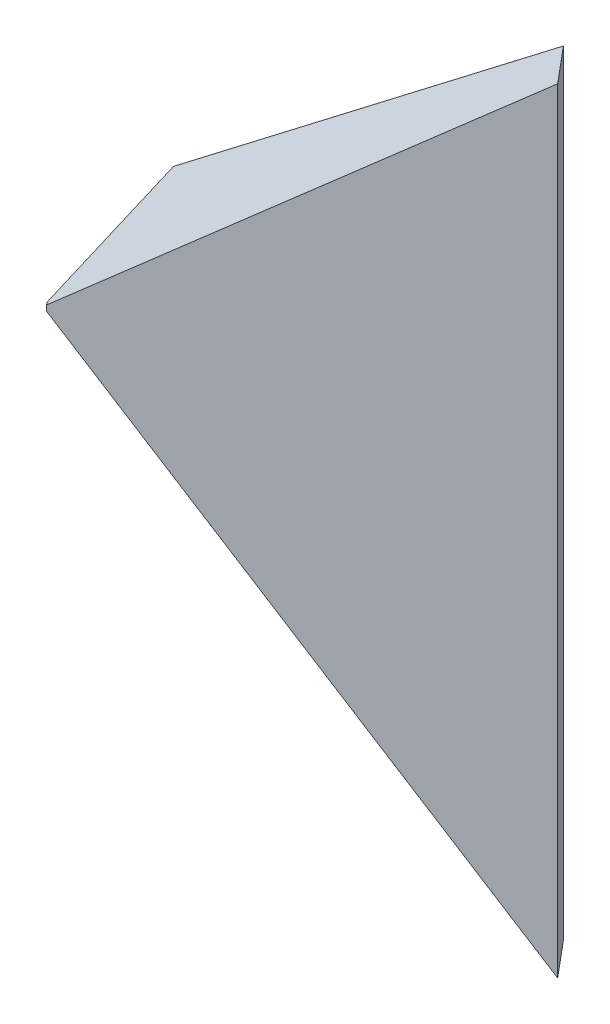
ISO-10303-21;
HEADER;
FILE_DESCRIPTION(('STEP AP214'),'2;1');
FILE_NAME('part.step','',(''),(''),'','','');
FILE_SCHEMA(('AUTOMOTIVE_DESIGN { 1 0 10303 214 1 1 1 1 }'));
ENDSEC;
DATA;
#1=APPLICATION_CONTEXT('core data for automotive mechanical design processes');
#2=APPLICATION_PROTOCOL_DEFINITION('international standard','automotive_design',2000,#1);
#3=PRODUCT_CONTEXT('',#1,'mechanical');
#4=PRODUCT('Part','Part','',(#3));
#5=PRODUCT_RELATED_PRODUCT_CATEGORY('part','',(#4));
#6=PRODUCT_DEFINITION_FORMATION('','',#4);
#7=PRODUCT_DEFINITION_CONTEXT('part definition',#1,'design');
#8=PRODUCT_DEFINITION('design','',#6,#7);
#9=PRODUCT_DEFINITION_SHAPE('','',#8);
#10=(LENGTH_UNIT() NAMED_UNIT(*) SI_UNIT(.MILLI.,.METRE.));
#11=(NAMED_UNIT(*) PLANE_ANGLE_UNIT() SI_UNIT($,.RADIAN.));
#12=(NAMED_UNIT(*) SI_UNIT($,.STERADIAN.) SOLID_ANGLE_UNIT());
#13=UNCERTAINTY_MEASURE_WITH_UNIT(LENGTH_MEASURE(1.E-05),#10,'distance_accuracy_value','');
#14=(GEOMETRIC_REPRESENTATION_CONTEXT(3) GLOBAL_UNCERTAINTY_ASSIGNED_CONTEXT((#13)) GLOBAL_UNIT_ASSIGNED_CONTEXT((#10,
#11,#12)) REPRESENTATION_CONTEXT('',''));
#15=CARTESIAN_POINT('',(0.,0.,0.));
#16=DIRECTION('',(0.,0.,1.));
#17=DIRECTION('',(1.,0.,0.));
#18=AXIS2_PLACEMENT_3D('',#15,#16,#17);
#19=CARTESIAN_POINT('',(775.8872661241,-32.34968528151,98.962617294373));
#20=DIRECTION('',(0.138308876163015,0.,0.990389143102106));
#21=DIRECTION('',(0.,-1.,0.));
#22=AXIS2_PLACEMENT_3D('',#19,#20,#21);
#23=PLANE('',#22);
#24=DIRECTION('',(0.,1.,0.));
#25=VECTOR('',#24,1.);
#26=CARTESIAN_POINT('',(211.19114167393,-37.35841955208,177.82301968278));
#27=LINE('',#26,#25);
#28=CARTESIAN_POINT('',(211.19114167393,-37.35841955208,177.82301968278));
#29=VERTEX_POINT('',#28);
#30=CARTESIAN_POINT('',(211.19114167393,-27.34095101094,177.82301968278));
#31=VERTEX_POINT('',#30);
#32=EDGE_CURVE('E10',#29,#31,#27,.T.);
#33=ORIENTED_EDGE('',*,*,#32,.F.);
#34=DIRECTION('',(0.754964302462711,-0.647234957258752,-0.10543155177296));
#35=VECTOR('',#34,1.);
#36=CARTESIAN_POINT('',(211.19114167393,-37.35841955208,177.82301968278));
#37=LINE('',#36,#35);
#38=CARTESIAN_POINT('',(1023.286902266,-733.5724831607,64.413000231037));
#39=VERTEX_POINT('',#38);
#40=EDGE_CURVE('E83',#29,#39,#37,.T.);
#41=ORIENTED_EDGE('',*,*,#40,.T.);
#42=DIRECTION('',(0.,-1.,0.));
#43=VECTOR('',#42,1.);
#44=CARTESIAN_POINT('',(1023.286902266,668.87311259773,64.413000231037));
#45=LINE('',#44,#43);
#46=CARTESIAN_POINT('',(1023.286902266,668.87311259773,64.413000231037));
#47=VERTEX_POINT('',#46);
#48=EDGE_CURVE('E19',#47,#39,#45,.T.);
#49=ORIENTED_EDGE('',*,*,#48,.F.);
#50=DIRECTION('',(-0.754964302462711,-0.647234957258752,0.10543155177296));
#51=VECTOR('',#50,1.);
#52=CARTESIAN_POINT('',(1023.286902266,668.87311259773,64.413000231037));
#53=LINE('',#52,#51);
#54=EDGE_CURVE('E128',#47,#31,#53,.T.);
#55=ORIENTED_EDGE('',*,*,#54,.T.);
#56=EDGE_LOOP('',(#33,#41,#49,#55));
#57=FACE_BOUND('',#56,.T.);
#58=ADVANCED_FACE('F15',(#57),#23,.T.);
#59=CARTESIAN_POINT('',(209.1789483457,-32.34968528151,175.42498105486));
#60=DIRECTION('',(-0.76604444311876,0.,0.642787609686799));
#61=DIRECTION('',(0.,1.,0.));
#62=AXIS2_PLACEMENT_3D('',#59,#60,#61);
#63=PLANE('',#62);
#64=DIRECTION('',(-0.642787609686799,0.,-0.76604444311876));
#65=VECTOR('',#64,1.);
#66=CARTESIAN_POINT('',(211.19114167393,-27.34095101094,177.82301968278));
#67=LINE('',#66,#65);
#68=CARTESIAN_POINT('',(207.16675501746,-27.34095101094,173.02694242694));
#69=VERTEX_POINT('',#68);
#70=EDGE_CURVE('E78',#31,#69,#67,.T.);
#71=ORIENTED_EDGE('',*,*,#70,.T.);
#72=DIRECTION('',(0.,-1.,0.));
#73=VECTOR('',#72,1.);
#74=CARTESIAN_POINT('',(207.16675501746,-27.34095101094,173.02694242694));
#75=LINE('',#74,#73);
#76=CARTESIAN_POINT('',(207.16675501746,-37.35841955208,173.02694242694));
#77=VERTEX_POINT('',#76);
#78=EDGE_CURVE('E72',#69,#77,#75,.T.);
#79=ORIENTED_EDGE('',*,*,#78,.T.);
#80=DIRECTION('',(0.642787609686799,0.,0.76604444311876));
#81=VECTOR('',#80,1.);
#82=CARTESIAN_POINT('',(207.16675501746,-37.35841955208,173.02694242694));
#83=LINE('',#82,#81);
#84=EDGE_CURVE('E76',#77,#29,#83,.T.);
#85=ORIENTED_EDGE('',*,*,#84,.T.);
#86=ORIENTED_EDGE('',*,*,#32,.T.);
#87=EDGE_LOOP('',(#71,#79,#85,#86));
#88=FACE_BOUND('',#87,.T.);
#89=ADVANCED_FACE('F74',(#88),#63,.T.);
#90=CARTESIAN_POINT('',(741.57983631339,-32.34968528151,-271.3124076772));
#91=DIRECTION('',(0.76604444311876,0.,-0.642787609686799));
#92=DIRECTION('',(0.,-1.,0.));
#93=AXIS2_PLACEMENT_3D('',#90,#91,#92);
#94=PLANE('',#93);
#95=DIRECTION('',(0.642787609686799,0.,0.76604444311876));
#96=VECTOR('',#95,1.);
#97=CARTESIAN_POINT('',(459.87277036068,668.87311259773,-607.0378155855));
#98=LINE('',#97,#96);
#99=CARTESIAN_POINT('',(969.23797752921,668.87311259773,0.));
#100=VERTEX_POINT('',#99);
#101=EDGE_CURVE('E131',#100,#47,#98,.T.);
#102=ORIENTED_EDGE('',*,*,#101,.T.);
#103=ORIENTED_EDGE('',*,*,#48,.T.);
#104=DIRECTION('',(-0.642787609686799,0.,-0.76604444311876));
#105=VECTOR('',#104,1.);
#106=CARTESIAN_POINT('',(1023.286902266,-733.5724831607,64.413000231037));
#107=LINE('',#106,#105);
#108=CARTESIAN_POINT('',(969.23797752921,-733.5724831607,0.));
#109=VERTEX_POINT('',#108);
#110=EDGE_CURVE('E95',#39,#109,#107,.T.);
#111=ORIENTED_EDGE('',*,*,#110,.T.);
#112=DIRECTION('',(0.,1.,0.));
#113=VECTOR('',#112,1.);
#114=CARTESIAN_POINT('',(969.23797752921,-641.1748426407,0.));
#115=LINE('',#114,#113);
#116=EDGE_CURVE('E106',#109,#100,#115,.T.);
#117=ORIENTED_EDGE('',*,*,#116,.T.);
#118=EDGE_LOOP('',(#102,#103,#111,#117));
#119=FACE_BOUND('',#118,.T.);
#120=ADVANCED_FACE('F141',(#119),#94,.T.);
#121=CARTESIAN_POINT('',(551.73169010198,420.61103729022,-112.0108982115));
#122=DIRECTION('',(-0.542147714908736,0.706489444943656,0.454915947623779));
#123=DIRECTION('',(0.642787609686749,0.,0.766044443118802));
#124=AXIS2_PLACEMENT_3D('',#121,#122,#123);
#125=PLANE('',#124);
#126=ORIENTED_EDGE('',*,*,#70,.F.);
#127=ORIENTED_EDGE('',*,*,#54,.F.);
#128=ORIENTED_EDGE('',*,*,#101,.F.);
#129=DIRECTION('',(-0.793332027845371,-0.608789202922285,0.));
#130=VECTOR('',#129,1.);
#131=CARTESIAN_POINT('',(-273.7054446386,-284.9400560373,0.));
#132=LINE('',#131,#130);
#133=CARTESIAN_POINT('',(263.21972846436,127.08698521292,0.));
#134=VERTEX_POINT('',#133);
#135=EDGE_CURVE('E110',#100,#134,#132,.T.);
#136=ORIENTED_EDGE('',*,*,#135,.T.);
#137=DIRECTION('',(0.234927984924886,0.647234957258685,-0.725186701478647));
#138=VECTOR('',#137,1.);
#139=CARTESIAN_POINT('',(207.16675501746,-27.34095101094,173.02694242694));
#140=LINE('',#139,#138);
#141=EDGE_CURVE('E82',#69,#134,#140,.T.);
#142=ORIENTED_EDGE('',*,*,#141,.F.);
#143=EDGE_LOOP('',(#126,#127,#128,#136,#142));
#144=FACE_BOUND('',#143,.T.);
#145=ADVANCED_FACE('F151',(#144),#125,.T.);
#146=CARTESIAN_POINT('',(382.88754364158,-32.34968528151,-369.3962138627));
#147=DIRECTION('',(-0.95132582232534,0.,-0.30818692343611));
#148=DIRECTION('',(-0.30818692343611,0.,0.95132582232534));
#149=AXIS2_PLACEMENT_3D('',#146,#147,#148);
#150=PLANE('',#149);
#151=ORIENTED_EDGE('',*,*,#78,.F.);
#152=ORIENTED_EDGE('',*,*,#141,.T.);
#153=DIRECTION('',(0.,-1.,0.));
#154=VECTOR('',#153,1.);
#155=CARTESIAN_POINT('',(263.21972846436,-641.1748426407,0.));
#156=LINE('',#155,#154);
#157=CARTESIAN_POINT('',(263.21972846436,-191.7863557759,0.));
#158=VERTEX_POINT('',#157);
#159=EDGE_CURVE('E90',#134,#158,#156,.T.);
#160=ORIENTED_EDGE('',*,*,#159,.T.);
#161=DIRECTION('',(0.234927984924886,-0.647234957258685,-0.725186701478647));
#162=VECTOR('',#161,1.);
#163=CARTESIAN_POINT('',(207.16675501746,-37.35841955208,173.02694242694));
#164=LINE('',#163,#162);
#165=EDGE_CURVE('E87',#77,#158,#164,.T.);
#166=ORIENTED_EDGE('',*,*,#165,.F.);
#167=EDGE_LOOP('',(#151,#152,#160,#166));
#168=FACE_BOUND('',#167,.T.);
#169=ADVANCED_FACE('F88',(#168),#150,.T.);
#170=CARTESIAN_POINT('',(551.73169010198,-485.3104078532,-112.0108982115));
#171=DIRECTION('',(-0.542147714908736,-0.706489444943656,0.454915947623779));
#172=DIRECTION('',(-0.793332027845354,0.608789202922308,0.));
#173=AXIS2_PLACEMENT_3D('',#170,#171,#172);
#174=PLANE('',#173);
#175=ORIENTED_EDGE('',*,*,#84,.F.);
#176=ORIENTED_EDGE('',*,*,#165,.T.);
#177=DIRECTION('',(0.793332027845371,-0.608789202922285,0.));
#178=VECTOR('',#177,1.);
#179=CARTESIAN_POINT('',(314.38553014457,-231.0501022634,0.));
#180=LINE('',#179,#178);
#181=EDGE_CURVE('E100',#158,#109,#180,.T.);
#182=ORIENTED_EDGE('',*,*,#181,.T.);
#183=ORIENTED_EDGE('',*,*,#110,.F.);
#184=ORIENTED_EDGE('',*,*,#40,.F.);
#185=EDGE_LOOP('',(#175,#176,#182,#183,#184));
#186=FACE_BOUND('',#185,.T.);
#187=ADVANCED_FACE('F97',(#186),#174,.T.);
#188=CARTESIAN_POINT('',(-900.,-1250.,0.));
#189=DIRECTION('',(0.,0.,1.));
#190=DIRECTION('',(1.,0.,0.));
#191=AXIS2_PLACEMENT_3D('',#188,#189,#190);
#192=PLANE('',#191);
#193=ORIENTED_EDGE('',*,*,#159,.F.);
#194=ORIENTED_EDGE('',*,*,#135,.F.);
#195=ORIENTED_EDGE('',*,*,#116,.F.);
#196=ORIENTED_EDGE('',*,*,#181,.F.);
#197=EDGE_LOOP('',(#193,#194,#195,#196));
#198=FACE_BOUND('',#197,.T.);
#199=ADVANCED_FACE('F17',(#198),#192,.F.);
#200=CLOSED_SHELL('',(#58,#89,#120,#145,#169,#187,#199));
#201=MANIFOLD_SOLID_BREP('B1',#200);
#202=ADVANCED_BREP_SHAPE_REPRESENTATION('',(#18,#201),#14);
#203=SHAPE_DEFINITION_REPRESENTATION(#9,#202);
ENDSEC;
END-ISO-10303-21;
